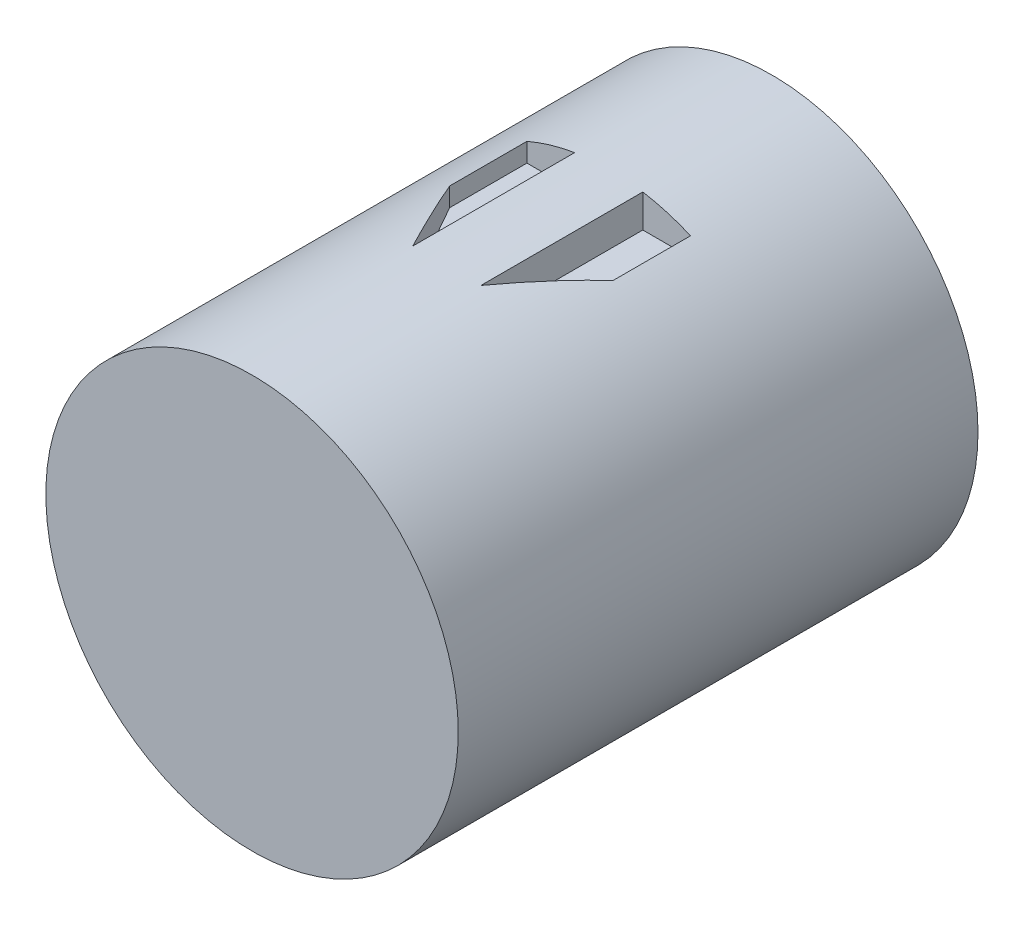
ISO-10303-21;
HEADER;
FILE_DESCRIPTION(('STEP AP214'),'2;1');
FILE_NAME('part.step','',(''),(''),'','','');
FILE_SCHEMA(('AUTOMOTIVE_DESIGN { 1 0 10303 214 1 1 1 1 }'));
ENDSEC;
DATA;
#1=APPLICATION_CONTEXT('core data for automotive mechanical design processes');
#2=APPLICATION_PROTOCOL_DEFINITION('international standard','automotive_design',2000,#1);
#3=PRODUCT_CONTEXT('',#1,'mechanical');
#4=PRODUCT('Part','Part','',(#3));
#5=PRODUCT_RELATED_PRODUCT_CATEGORY('part','',(#4));
#6=PRODUCT_DEFINITION_FORMATION('','',#4);
#7=PRODUCT_DEFINITION_CONTEXT('part definition',#1,'design');
#8=PRODUCT_DEFINITION('design','',#6,#7);
#9=PRODUCT_DEFINITION_SHAPE('','',#8);
#10=(LENGTH_UNIT() NAMED_UNIT(*) SI_UNIT(.MILLI.,.METRE.));
#11=(NAMED_UNIT(*) PLANE_ANGLE_UNIT() SI_UNIT($,.RADIAN.));
#12=(NAMED_UNIT(*) SI_UNIT($,.STERADIAN.) SOLID_ANGLE_UNIT());
#13=UNCERTAINTY_MEASURE_WITH_UNIT(LENGTH_MEASURE(1.E-05),#10,'distance_accuracy_value','');
#14=(GEOMETRIC_REPRESENTATION_CONTEXT(3) GLOBAL_UNCERTAINTY_ASSIGNED_CONTEXT((#13)) GLOBAL_UNIT_ASSIGNED_CONTEXT((#10,
#11,#12)) REPRESENTATION_CONTEXT('',''));
#15=CARTESIAN_POINT('',(0.,0.,0.));
#16=DIRECTION('',(0.,0.,1.));
#17=DIRECTION('',(1.,0.,0.));
#18=AXIS2_PLACEMENT_3D('',#15,#16,#17);
#19=CARTESIAN_POINT('',(0.,0.,30.5));
#20=DIRECTION('',(0.,0.,-1.));
#21=DIRECTION('',(-1.,0.,0.));
#22=AXIS2_PLACEMENT_3D('',#19,#20,#21);
#23=CYLINDRICAL_SURFACE('',#22,12.1);
#24=DIRECTION('',(0.,0.,-1.));
#25=VECTOR('',#24,1.);
#26=CARTESIAN_POINT('',(-2.,11.9335661057372,30.5));
#27=LINE('',#26,#25);
#28=CARTESIAN_POINT('',(-2.,11.9335661057372,19.0691885557519));
#29=VERTEX_POINT('',#28);
#30=CARTESIAN_POINT('',(-2.,11.9335661057372,9.56918855575188));
#31=VERTEX_POINT('',#30);
#32=EDGE_CURVE('E157',#29,#31,#27,.T.);
#33=ORIENTED_EDGE('',*,*,#32,.F.);
#34=CARTESIAN_POINT('',(0.,0.,22.615529009268));
#35=DIRECTION('',(0.871030988582906,0.,-0.491228070175439));
#36=DIRECTION('',(-0.491228070175439,0.,-0.871030988582906));
#37=AXIS2_PLACEMENT_3D('',#34,#35,#36);
#38=ELLIPSE('',#37,24.6321428571429,12.1);
#39=CARTESIAN_POINT('',(-4.8,11.1072048689128,14.1043119208293));
#40=VERTEX_POINT('',#39);
#41=EDGE_CURVE('E149',#40,#29,#38,.T.);
#42=ORIENTED_EDGE('',*,*,#41,.F.);
#43=DIRECTION('',(0.,0.,-1.));
#44=VECTOR('',#43,1.);
#45=CARTESIAN_POINT('',(-4.8,11.1072048689128,30.5));
#46=LINE('',#45,#44);
#47=CARTESIAN_POINT('',(-4.8,11.1072048689128,9.56918855575188));
#48=VERTEX_POINT('',#47);
#49=EDGE_CURVE('E153',#48,#40,#46,.F.);
#50=ORIENTED_EDGE('',*,*,#49,.F.);
#51=CARTESIAN_POINT('',(0.,0.,9.56918855575188));
#52=DIRECTION('',(0.,0.,1.));
#53=DIRECTION('',(1.,0.,0.));
#54=AXIS2_PLACEMENT_3D('',#51,#52,#53);
#55=CIRCLE('',#54,12.1);
#56=EDGE_CURVE('E155',#31,#48,#55,.T.);
#57=ORIENTED_EDGE('',*,*,#56,.F.);
#58=EDGE_LOOP('',(#33,#42,#50,#57));
#59=FACE_BOUND('',#58,.T.);
#60=CARTESIAN_POINT('',(0.,0.,30.5));
#61=DIRECTION('',(0.,0.,1.));
#62=DIRECTION('',(1.,0.,0.));
#63=AXIS2_PLACEMENT_3D('',#60,#61,#62);
#64=CIRCLE('',#63,12.1);
#65=CARTESIAN_POINT('',(12.1,0.,30.5));
#66=VERTEX_POINT('',#65);
#67=EDGE_CURVE('E146',#66,#66,#64,.T.);
#68=ORIENTED_EDGE('',*,*,#67,.F.);
#69=EDGE_LOOP('',(#68));
#70=FACE_BOUND('',#69,.T.);
#71=CARTESIAN_POINT('',(0.,0.,0.));
#72=DIRECTION('',(0.,0.,1.));
#73=DIRECTION('',(1.,0.,0.));
#74=AXIS2_PLACEMENT_3D('',#71,#72,#73);
#75=CIRCLE('',#74,12.1);
#76=CARTESIAN_POINT('',(12.1,0.,0.));
#77=VERTEX_POINT('',#76);
#78=EDGE_CURVE('E104',#77,#77,#75,.T.);
#79=ORIENTED_EDGE('',*,*,#78,.T.);
#80=EDGE_LOOP('',(#79));
#81=FACE_BOUND('',#80,.T.);
#82=DIRECTION('',(0.,0.,-1.));
#83=VECTOR('',#82,1.);
#84=CARTESIAN_POINT('',(4.8,11.1072048689128,30.5));
#85=LINE('',#84,#83);
#86=CARTESIAN_POINT('',(4.8,11.1072048689128,14.1043119208293));
#87=VERTEX_POINT('',#86);
#88=CARTESIAN_POINT('',(4.8,11.1072048689128,9.56918855575187));
#89=VERTEX_POINT('',#88);
#90=EDGE_CURVE('E11',#87,#89,#85,.T.);
#91=ORIENTED_EDGE('',*,*,#90,.F.);
#92=CARTESIAN_POINT('',(0.,0.,22.615529009268));
#93=DIRECTION('',(-0.871030988582906,0.,-0.491228070175439));
#94=DIRECTION('',(0.491228070175439,0.,-0.871030988582906));
#95=AXIS2_PLACEMENT_3D('',#92,#93,#94);
#96=ELLIPSE('',#95,24.6321428571428,12.1);
#97=CARTESIAN_POINT('',(2.,11.9335661057372,19.0691885557519));
#98=VERTEX_POINT('',#97);
#99=EDGE_CURVE('E159',#98,#87,#96,.T.);
#100=ORIENTED_EDGE('',*,*,#99,.F.);
#101=DIRECTION('',(0.,0.,-1.));
#102=VECTOR('',#101,1.);
#103=CARTESIAN_POINT('',(2.,11.9335661057372,30.5));
#104=LINE('',#103,#102);
#105=CARTESIAN_POINT('',(2.,11.9335661057372,9.56918855575187));
#106=VERTEX_POINT('',#105);
#107=EDGE_CURVE('E161',#106,#98,#104,.F.);
#108=ORIENTED_EDGE('',*,*,#107,.F.);
#109=CARTESIAN_POINT('',(0.,0.,9.56918855575187));
#110=DIRECTION('',(0.,0.,1.));
#111=DIRECTION('',(1.,0.,0.));
#112=AXIS2_PLACEMENT_3D('',#109,#110,#111);
#113=CIRCLE('',#112,12.1);
#114=EDGE_CURVE('E39',#89,#106,#113,.T.);
#115=ORIENTED_EDGE('',*,*,#114,.F.);
#116=EDGE_LOOP('',(#91,#100,#108,#115));
#117=FACE_BOUND('',#116,.T.);
#118=ADVANCED_FACE('F32',(#59,#70,#81,#117),#23,.T.);
#119=CARTESIAN_POINT('',(0.,0.,30.5));
#120=DIRECTION('',(0.,0.,1.));
#121=DIRECTION('',(1.,0.,0.));
#122=AXIS2_PLACEMENT_3D('',#119,#120,#121);
#123=PLANE('',#122);
#124=ORIENTED_EDGE('',*,*,#67,.T.);
#125=EDGE_LOOP('',(#124));
#126=FACE_BOUND('',#125,.T.);
#127=ADVANCED_FACE('F177',(#126),#123,.T.);
#128=CARTESIAN_POINT('',(0.,0.,0.));
#129=DIRECTION('',(0.,0.,1.));
#130=DIRECTION('',(1.,0.,0.));
#131=AXIS2_PLACEMENT_3D('',#128,#129,#130);
#132=PLANE('',#131);
#133=ORIENTED_EDGE('',*,*,#78,.F.);
#134=EDGE_LOOP('',(#133));
#135=FACE_BOUND('',#134,.T.);
#136=ADVANCED_FACE('F182',(#135),#132,.F.);
#137=CARTESIAN_POINT('',(-2.,12.1,19.0691885557519));
#138=DIRECTION('',(-1.,0.,0.));
#139=DIRECTION('',(0.,0.,1.));
#140=AXIS2_PLACEMENT_3D('',#137,#138,#139);
#141=PLANE('',#140);
#142=ORIENTED_EDGE('',*,*,#32,.T.);
#143=DIRECTION('',(0.,-1.,0.));
#144=VECTOR('',#143,1.);
#145=CARTESIAN_POINT('',(-2.,12.1,9.56918855575188));
#146=LINE('',#145,#144);
#147=CARTESIAN_POINT('',(-2.,10.,9.56918855575188));
#148=VERTEX_POINT('',#147);
#149=EDGE_CURVE('E119',#31,#148,#146,.T.);
#150=ORIENTED_EDGE('',*,*,#149,.T.);
#151=DIRECTION('',(0.,0.,-1.));
#152=VECTOR('',#151,1.);
#153=CARTESIAN_POINT('',(-2.,10.,19.0691885557519));
#154=LINE('',#153,#152);
#155=CARTESIAN_POINT('',(-2.,10.,19.0691885557519));
#156=VERTEX_POINT('',#155);
#157=EDGE_CURVE('E130',#156,#148,#154,.T.);
#158=ORIENTED_EDGE('',*,*,#157,.F.);
#159=DIRECTION('',(0.,-1.,0.));
#160=VECTOR('',#159,1.);
#161=CARTESIAN_POINT('',(-2.,12.1,19.0691885557519));
#162=LINE('',#161,#160);
#163=EDGE_CURVE('E142',#29,#156,#162,.T.);
#164=ORIENTED_EDGE('',*,*,#163,.F.);
#165=EDGE_LOOP('',(#142,#150,#158,#164));
#166=FACE_BOUND('',#165,.T.);
#167=ADVANCED_FACE('F194',(#166),#141,.T.);
#168=CARTESIAN_POINT('',(-2.,12.1,9.56918855575188));
#169=DIRECTION('',(0.,0.,1.));
#170=DIRECTION('',(1.,0.,0.));
#171=AXIS2_PLACEMENT_3D('',#168,#169,#170);
#172=PLANE('',#171);
#173=ORIENTED_EDGE('',*,*,#56,.T.);
#174=DIRECTION('',(0.,-1.,0.));
#175=VECTOR('',#174,1.);
#176=CARTESIAN_POINT('',(-4.8,12.1,9.56918855575188));
#177=LINE('',#176,#175);
#178=CARTESIAN_POINT('',(-4.8,10.,9.56918855575188));
#179=VERTEX_POINT('',#178);
#180=EDGE_CURVE('E121',#48,#179,#177,.T.);
#181=ORIENTED_EDGE('',*,*,#180,.T.);
#182=DIRECTION('',(-1.,0.,0.));
#183=VECTOR('',#182,1.);
#184=CARTESIAN_POINT('',(-2.,10.,9.56918855575188));
#185=LINE('',#184,#183);
#186=EDGE_CURVE('E133',#148,#179,#185,.T.);
#187=ORIENTED_EDGE('',*,*,#186,.F.);
#188=ORIENTED_EDGE('',*,*,#149,.F.);
#189=EDGE_LOOP('',(#173,#181,#187,#188));
#190=FACE_BOUND('',#189,.T.);
#191=ADVANCED_FACE('F198',(#190),#172,.T.);
#192=CARTESIAN_POINT('',(-4.8,12.1,9.56918855575188));
#193=DIRECTION('',(1.,0.,0.));
#194=DIRECTION('',(0.,0.,-1.));
#195=AXIS2_PLACEMENT_3D('',#192,#193,#194);
#196=PLANE('',#195);
#197=ORIENTED_EDGE('',*,*,#49,.T.);
#198=DIRECTION('',(0.,-1.,0.));
#199=VECTOR('',#198,1.);
#200=CARTESIAN_POINT('',(-4.8,12.1,14.1043119208293));
#201=LINE('',#200,#199);
#202=CARTESIAN_POINT('',(-4.8,10.,14.1043119208293));
#203=VERTEX_POINT('',#202);
#204=EDGE_CURVE('E54',#40,#203,#201,.T.);
#205=ORIENTED_EDGE('',*,*,#204,.T.);
#206=DIRECTION('',(0.,0.,1.));
#207=VECTOR('',#206,1.);
#208=CARTESIAN_POINT('',(-4.8,10.,9.56918855575188));
#209=LINE('',#208,#207);
#210=EDGE_CURVE('E136',#179,#203,#209,.T.);
#211=ORIENTED_EDGE('',*,*,#210,.F.);
#212=ORIENTED_EDGE('',*,*,#180,.F.);
#213=EDGE_LOOP('',(#197,#205,#211,#212));
#214=FACE_BOUND('',#213,.T.);
#215=ADVANCED_FACE('F204',(#214),#196,.T.);
#216=CARTESIAN_POINT('',(-4.8,12.1,14.1043119208293));
#217=DIRECTION('',(0.871030988582906,0.,-0.491228070175439));
#218=DIRECTION('',(-0.491228070175439,0.,-0.871030988582906));
#219=AXIS2_PLACEMENT_3D('',#216,#217,#218);
#220=PLANE('',#219);
#221=ORIENTED_EDGE('',*,*,#41,.T.);
#222=ORIENTED_EDGE('',*,*,#163,.T.);
#223=DIRECTION('',(0.491228070175439,0.,0.871030988582906));
#224=VECTOR('',#223,1.);
#225=CARTESIAN_POINT('',(-4.8,10.,14.1043119208293));
#226=LINE('',#225,#224);
#227=EDGE_CURVE('E139',#203,#156,#226,.T.);
#228=ORIENTED_EDGE('',*,*,#227,.F.);
#229=ORIENTED_EDGE('',*,*,#204,.F.);
#230=EDGE_LOOP('',(#221,#222,#228,#229));
#231=FACE_BOUND('',#230,.T.);
#232=ADVANCED_FACE('F208',(#231),#220,.T.);
#233=CARTESIAN_POINT('',(0.,10.,0.));
#234=DIRECTION('',(0.,1.,0.));
#235=DIRECTION('',(0.,0.,1.));
#236=AXIS2_PLACEMENT_3D('',#233,#234,#235);
#237=PLANE('',#236);
#238=ORIENTED_EDGE('',*,*,#157,.T.);
#239=ORIENTED_EDGE('',*,*,#186,.T.);
#240=ORIENTED_EDGE('',*,*,#210,.T.);
#241=ORIENTED_EDGE('',*,*,#227,.T.);
#242=EDGE_LOOP('',(#238,#239,#240,#241));
#243=FACE_BOUND('',#242,.T.);
#244=ADVANCED_FACE('F212',(#243),#237,.T.);
#245=CARTESIAN_POINT('',(4.8,12.1,9.56918855575187));
#246=DIRECTION('',(-1.,0.,0.));
#247=DIRECTION('',(0.,0.,1.));
#248=AXIS2_PLACEMENT_3D('',#245,#246,#247);
#249=PLANE('',#248);
#250=ORIENTED_EDGE('',*,*,#90,.T.);
#251=DIRECTION('',(0.,-1.,0.));
#252=VECTOR('',#251,1.);
#253=CARTESIAN_POINT('',(4.8,12.1,9.56918855575187));
#254=LINE('',#253,#252);
#255=CARTESIAN_POINT('',(4.8,10.,9.56918855575187));
#256=VERTEX_POINT('',#255);
#257=EDGE_CURVE('E95',#89,#256,#254,.T.);
#258=ORIENTED_EDGE('',*,*,#257,.T.);
#259=DIRECTION('',(0.,0.,-1.));
#260=VECTOR('',#259,1.);
#261=CARTESIAN_POINT('',(4.8,10.,9.56918855575187));
#262=LINE('',#261,#260);
#263=CARTESIAN_POINT('',(4.8,10.,14.1043119208293));
#264=VERTEX_POINT('',#263);
#265=EDGE_CURVE('E100',#264,#256,#262,.T.);
#266=ORIENTED_EDGE('',*,*,#265,.F.);
#267=DIRECTION('',(0.,-1.,0.));
#268=VECTOR('',#267,1.);
#269=CARTESIAN_POINT('',(4.8,12.1,14.1043119208293));
#270=LINE('',#269,#268);
#271=EDGE_CURVE('E126',#87,#264,#270,.T.);
#272=ORIENTED_EDGE('',*,*,#271,.F.);
#273=EDGE_LOOP('',(#250,#258,#266,#272));
#274=FACE_BOUND('',#273,.T.);
#275=ADVANCED_FACE('F97',(#274),#249,.T.);
#276=CARTESIAN_POINT('',(2.,12.1,9.56918855575187));
#277=DIRECTION('',(0.,0.,1.));
#278=DIRECTION('',(1.,0.,0.));
#279=AXIS2_PLACEMENT_3D('',#276,#277,#278);
#280=PLANE('',#279);
#281=ORIENTED_EDGE('',*,*,#114,.T.);
#282=DIRECTION('',(0.,-1.,0.));
#283=VECTOR('',#282,1.);
#284=CARTESIAN_POINT('',(2.,12.1,9.56918855575187));
#285=LINE('',#284,#283);
#286=CARTESIAN_POINT('',(2.,10.,9.56918855575187));
#287=VERTEX_POINT('',#286);
#288=EDGE_CURVE('E105',#106,#287,#285,.T.);
#289=ORIENTED_EDGE('',*,*,#288,.T.);
#290=DIRECTION('',(-1.,0.,0.));
#291=VECTOR('',#290,1.);
#292=CARTESIAN_POINT('',(2.,10.,9.56918855575187));
#293=LINE('',#292,#291);
#294=EDGE_CURVE('E108',#256,#287,#293,.T.);
#295=ORIENTED_EDGE('',*,*,#294,.F.);
#296=ORIENTED_EDGE('',*,*,#257,.F.);
#297=EDGE_LOOP('',(#281,#289,#295,#296));
#298=FACE_BOUND('',#297,.T.);
#299=ADVANCED_FACE('F109',(#298),#280,.T.);
#300=CARTESIAN_POINT('',(2.,12.1,19.0691885557519));
#301=DIRECTION('',(1.,0.,0.));
#302=DIRECTION('',(0.,0.,-1.));
#303=AXIS2_PLACEMENT_3D('',#300,#301,#302);
#304=PLANE('',#303);
#305=ORIENTED_EDGE('',*,*,#107,.T.);
#306=DIRECTION('',(0.,-1.,0.));
#307=VECTOR('',#306,1.);
#308=CARTESIAN_POINT('',(2.,12.1,19.0691885557519));
#309=LINE('',#308,#307);
#310=CARTESIAN_POINT('',(2.,10.,19.0691885557519));
#311=VERTEX_POINT('',#310);
#312=EDGE_CURVE('E46',#98,#311,#309,.T.);
#313=ORIENTED_EDGE('',*,*,#312,.T.);
#314=DIRECTION('',(0.,0.,1.));
#315=VECTOR('',#314,1.);
#316=CARTESIAN_POINT('',(2.,10.,19.0691885557519));
#317=LINE('',#316,#315);
#318=EDGE_CURVE('E114',#287,#311,#317,.T.);
#319=ORIENTED_EDGE('',*,*,#318,.F.);
#320=ORIENTED_EDGE('',*,*,#288,.F.);
#321=EDGE_LOOP('',(#305,#313,#319,#320));
#322=FACE_BOUND('',#321,.T.);
#323=ADVANCED_FACE('F165',(#322),#304,.T.);
#324=CARTESIAN_POINT('',(4.8,12.1,14.1043119208293));
#325=DIRECTION('',(-0.871030988582906,0.,-0.491228070175439));
#326=DIRECTION('',(-0.491228070175439,0.,0.871030988582906));
#327=AXIS2_PLACEMENT_3D('',#324,#325,#326);
#328=PLANE('',#327);
#329=ORIENTED_EDGE('',*,*,#99,.T.);
#330=ORIENTED_EDGE('',*,*,#271,.T.);
#331=DIRECTION('',(0.491228070175439,0.,-0.871030988582906));
#332=VECTOR('',#331,1.);
#333=CARTESIAN_POINT('',(4.8,10.,14.1043119208293));
#334=LINE('',#333,#332);
#335=EDGE_CURVE('E118',#311,#264,#334,.T.);
#336=ORIENTED_EDGE('',*,*,#335,.F.);
#337=ORIENTED_EDGE('',*,*,#312,.F.);
#338=EDGE_LOOP('',(#329,#330,#336,#337));
#339=FACE_BOUND('',#338,.T.);
#340=ADVANCED_FACE('F167',(#339),#328,.T.);
#341=CARTESIAN_POINT('',(0.,10.,0.));
#342=DIRECTION('',(0.,1.,0.));
#343=DIRECTION('',(0.,0.,1.));
#344=AXIS2_PLACEMENT_3D('',#341,#342,#343);
#345=PLANE('',#344);
#346=ORIENTED_EDGE('',*,*,#265,.T.);
#347=ORIENTED_EDGE('',*,*,#294,.T.);
#348=ORIENTED_EDGE('',*,*,#318,.T.);
#349=ORIENTED_EDGE('',*,*,#335,.T.);
#350=EDGE_LOOP('',(#346,#347,#348,#349));
#351=FACE_BOUND('',#350,.T.);
#352=ADVANCED_FACE('F117',(#351),#345,.T.);
#353=CLOSED_SHELL('',(#118,#127,#136,#167,#191,#215,#232,#244,#275,#299,#323,#340,#352));
#354=MANIFOLD_SOLID_BREP('B2',#353);
#355=ADVANCED_BREP_SHAPE_REPRESENTATION('',(#18,#354),#14);
#356=SHAPE_DEFINITION_REPRESENTATION(#9,#355);
ENDSEC;
END-ISO-10303-21;
